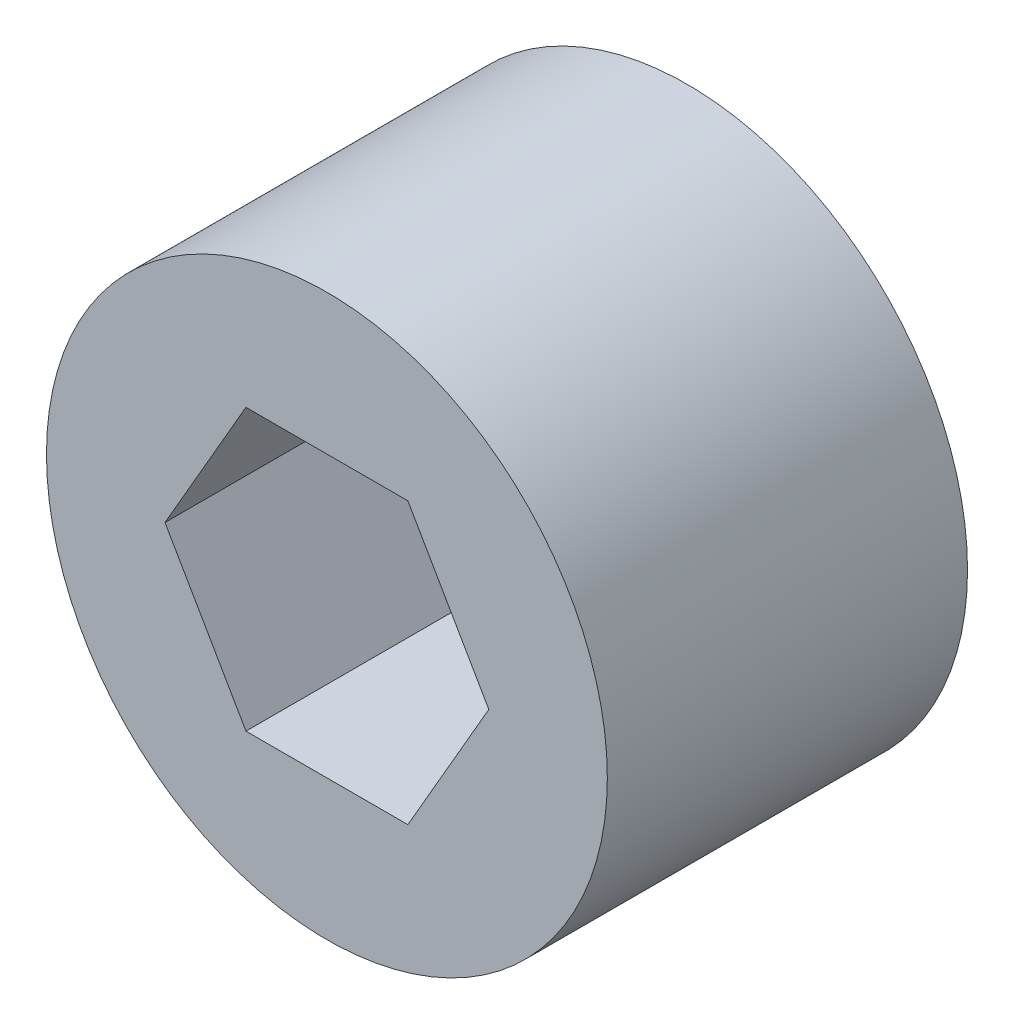
ISO-10303-21;
HEADER;
FILE_DESCRIPTION(('STEP AP214'),'2;1');
FILE_NAME('part.step','',(''),(''),'','','');
FILE_SCHEMA(('AUTOMOTIVE_DESIGN { 1 0 10303 214 1 1 1 1 }'));
ENDSEC;
DATA;
#1=APPLICATION_CONTEXT('core data for automotive mechanical design processes');
#2=APPLICATION_PROTOCOL_DEFINITION('international standard','automotive_design',2000,#1);
#3=PRODUCT_CONTEXT('',#1,'mechanical');
#4=PRODUCT('Part','Part','',(#3));
#5=PRODUCT_RELATED_PRODUCT_CATEGORY('part','',(#4));
#6=PRODUCT_DEFINITION_FORMATION('','',#4);
#7=PRODUCT_DEFINITION_CONTEXT('part definition',#1,'design');
#8=PRODUCT_DEFINITION('design','',#6,#7);
#9=PRODUCT_DEFINITION_SHAPE('','',#8);
#10=(LENGTH_UNIT() NAMED_UNIT(*) SI_UNIT(.MILLI.,.METRE.));
#11=(NAMED_UNIT(*) PLANE_ANGLE_UNIT() SI_UNIT($,.RADIAN.));
#12=(NAMED_UNIT(*) SI_UNIT($,.STERADIAN.) SOLID_ANGLE_UNIT());
#13=UNCERTAINTY_MEASURE_WITH_UNIT(LENGTH_MEASURE(1.E-05),#10,'distance_accuracy_value','');
#14=(GEOMETRIC_REPRESENTATION_CONTEXT(3) GLOBAL_UNCERTAINTY_ASSIGNED_CONTEXT((#13)) GLOBAL_UNIT_ASSIGNED_CONTEXT((#10,
#11,#12)) REPRESENTATION_CONTEXT('',''));
#15=CARTESIAN_POINT('',(0.,0.,0.));
#16=DIRECTION('',(0.,0.,1.));
#17=DIRECTION('',(1.,0.,0.));
#18=AXIS2_PLACEMENT_3D('',#15,#16,#17);
#19=CARTESIAN_POINT('',(0.,0.,8.15594));
#20=DIRECTION('',(0.,0.,1.));
#21=DIRECTION('',(1.,0.,0.));
#22=AXIS2_PLACEMENT_3D('',#19,#20,#21);
#23=PLANE('',#22);
#24=CARTESIAN_POINT('',(0.,0.,8.15594));
#25=DIRECTION('',(0.,0.,1.));
#26=DIRECTION('',(1.,0.,0.));
#27=AXIS2_PLACEMENT_3D('',#24,#25,#26);
#28=CIRCLE('',#27,12.7);
#29=CARTESIAN_POINT('',(12.7,0.,8.15594));
#30=VERTEX_POINT('',#29);
#31=EDGE_CURVE('E11',#30,#30,#28,.T.);
#32=ORIENTED_EDGE('',*,*,#31,.T.);
#33=EDGE_LOOP('',(#32));
#34=FACE_BOUND('',#33,.T.);
#35=DIRECTION('',(0.5,-0.866025403784439,0.));
#36=VECTOR('',#35,1.);
#37=CARTESIAN_POINT('',(-7.33234841870825,0.,8.15594));
#38=LINE('',#37,#36);
#39=CARTESIAN_POINT('',(-7.33234841870825,0.,8.15594));
#40=VERTEX_POINT('',#39);
#41=CARTESIAN_POINT('',(-3.66617420935412,-6.35,8.15594));
#42=VERTEX_POINT('',#41);
#43=EDGE_CURVE('E94',#40,#42,#38,.T.);
#44=ORIENTED_EDGE('',*,*,#43,.F.);
#45=DIRECTION('',(-0.5,-0.866025403784439,0.));
#46=VECTOR('',#45,1.);
#47=CARTESIAN_POINT('',(-3.66617420935412,6.35,8.15594));
#48=LINE('',#47,#46);
#49=CARTESIAN_POINT('',(-3.66617420935412,6.35,8.15594));
#50=VERTEX_POINT('',#49);
#51=EDGE_CURVE('E86',#50,#40,#48,.T.);
#52=ORIENTED_EDGE('',*,*,#51,.F.);
#53=DIRECTION('',(-1.,0.,0.));
#54=VECTOR('',#53,1.);
#55=CARTESIAN_POINT('',(3.66617420935412,6.35,8.15594));
#56=LINE('',#55,#54);
#57=CARTESIAN_POINT('',(3.66617420935412,6.35,8.15594));
#58=VERTEX_POINT('',#57);
#59=EDGE_CURVE('E114',#58,#50,#56,.T.);
#60=ORIENTED_EDGE('',*,*,#59,.F.);
#61=DIRECTION('',(-0.5,0.866025403784438,0.));
#62=VECTOR('',#61,1.);
#63=CARTESIAN_POINT('',(7.33234841870824,0.,8.15594));
#64=LINE('',#63,#62);
#65=CARTESIAN_POINT('',(7.33234841870824,0.,8.15594));
#66=VERTEX_POINT('',#65);
#67=EDGE_CURVE('E112',#66,#58,#64,.T.);
#68=ORIENTED_EDGE('',*,*,#67,.F.);
#69=DIRECTION('',(0.5,0.866025403784439,0.));
#70=VECTOR('',#69,1.);
#71=CARTESIAN_POINT('',(3.66617420935412,-6.35,8.15594));
#72=LINE('',#71,#70);
#73=CARTESIAN_POINT('',(3.66617420935412,-6.35,8.15594));
#74=VERTEX_POINT('',#73);
#75=EDGE_CURVE('E108',#74,#66,#72,.T.);
#76=ORIENTED_EDGE('',*,*,#75,.F.);
#77=DIRECTION('',(1.,0.,0.));
#78=VECTOR('',#77,1.);
#79=CARTESIAN_POINT('',(-3.66617420935412,-6.35,8.15594));
#80=LINE('',#79,#78);
#81=EDGE_CURVE('E106',#42,#74,#80,.T.);
#82=ORIENTED_EDGE('',*,*,#81,.F.);
#83=EDGE_LOOP('',(#44,#52,#60,#68,#76,#82));
#84=FACE_BOUND('',#83,.T.);
#85=ADVANCED_FACE('F33',(#34,#84),#23,.T.);
#86=CARTESIAN_POINT('',(0.,0.,-8.15594));
#87=DIRECTION('',(0.,0.,1.));
#88=DIRECTION('',(1.,0.,0.));
#89=AXIS2_PLACEMENT_3D('',#86,#87,#88);
#90=PLANE('',#89);
#91=CARTESIAN_POINT('',(0.,0.,-8.15594));
#92=DIRECTION('',(0.,0.,1.));
#93=DIRECTION('',(1.,0.,0.));
#94=AXIS2_PLACEMENT_3D('',#91,#92,#93);
#95=CIRCLE('',#94,12.7);
#96=CARTESIAN_POINT('',(12.7,0.,-8.15594));
#97=VERTEX_POINT('',#96);
#98=EDGE_CURVE('E37',#97,#97,#95,.T.);
#99=ORIENTED_EDGE('',*,*,#98,.F.);
#100=EDGE_LOOP('',(#99));
#101=FACE_BOUND('',#100,.T.);
#102=DIRECTION('',(-0.5,-0.866025403784439,0.));
#103=VECTOR('',#102,1.);
#104=CARTESIAN_POINT('',(-3.66617420935412,6.35,-8.15594));
#105=LINE('',#104,#103);
#106=CARTESIAN_POINT('',(-3.66617420935412,6.35,-8.15594));
#107=VERTEX_POINT('',#106);
#108=CARTESIAN_POINT('',(-7.33234841870825,0.,-8.15594));
#109=VERTEX_POINT('',#108);
#110=EDGE_CURVE('E56',#107,#109,#105,.T.);
#111=ORIENTED_EDGE('',*,*,#110,.T.);
#112=DIRECTION('',(0.5,-0.866025403784439,0.));
#113=VECTOR('',#112,1.);
#114=CARTESIAN_POINT('',(-7.33234841870825,0.,-8.15594));
#115=LINE('',#114,#113);
#116=CARTESIAN_POINT('',(-3.66617420935412,-6.35,-8.15594));
#117=VERTEX_POINT('',#116);
#118=EDGE_CURVE('E101',#109,#117,#115,.T.);
#119=ORIENTED_EDGE('',*,*,#118,.T.);
#120=DIRECTION('',(1.,0.,0.));
#121=VECTOR('',#120,1.);
#122=CARTESIAN_POINT('',(-3.66617420935412,-6.35,-8.15594));
#123=LINE('',#122,#121);
#124=CARTESIAN_POINT('',(3.66617420935412,-6.35,-8.15594));
#125=VERTEX_POINT('',#124);
#126=EDGE_CURVE('E118',#117,#125,#123,.T.);
#127=ORIENTED_EDGE('',*,*,#126,.T.);
#128=DIRECTION('',(0.5,0.866025403784439,0.));
#129=VECTOR('',#128,1.);
#130=CARTESIAN_POINT('',(3.66617420935412,-6.35,-8.15594));
#131=LINE('',#130,#129);
#132=CARTESIAN_POINT('',(7.33234841870824,0.,-8.15594));
#133=VERTEX_POINT('',#132);
#134=EDGE_CURVE('E121',#125,#133,#131,.T.);
#135=ORIENTED_EDGE('',*,*,#134,.T.);
#136=DIRECTION('',(-0.5,0.866025403784438,0.));
#137=VECTOR('',#136,1.);
#138=CARTESIAN_POINT('',(7.33234841870824,0.,-8.15594));
#139=LINE('',#138,#137);
#140=CARTESIAN_POINT('',(3.66617420935412,6.35,-8.15594));
#141=VERTEX_POINT('',#140);
#142=EDGE_CURVE('E124',#133,#141,#139,.T.);
#143=ORIENTED_EDGE('',*,*,#142,.T.);
#144=DIRECTION('',(-1.,0.,0.));
#145=VECTOR('',#144,1.);
#146=CARTESIAN_POINT('',(3.66617420935412,6.35,-8.15594));
#147=LINE('',#146,#145);
#148=EDGE_CURVE('E95',#141,#107,#147,.T.);
#149=ORIENTED_EDGE('',*,*,#148,.T.);
#150=EDGE_LOOP('',(#111,#119,#127,#135,#143,#149));
#151=FACE_BOUND('',#150,.T.);
#152=ADVANCED_FACE('F141',(#101,#151),#90,.F.);
#153=CARTESIAN_POINT('',(0.,0.,8.15594));
#154=DIRECTION('',(0.,0.,-1.));
#155=DIRECTION('',(-1.,0.,0.));
#156=AXIS2_PLACEMENT_3D('',#153,#154,#155);
#157=CYLINDRICAL_SURFACE('',#156,12.7);
#158=ORIENTED_EDGE('',*,*,#31,.F.);
#159=EDGE_LOOP('',(#158));
#160=FACE_BOUND('',#159,.T.);
#161=ORIENTED_EDGE('',*,*,#98,.T.);
#162=EDGE_LOOP('',(#161));
#163=FACE_BOUND('',#162,.T.);
#164=ADVANCED_FACE('F35',(#160,#163),#157,.T.);
#165=CARTESIAN_POINT('',(-3.66617420935412,6.35,8.15594));
#166=DIRECTION('',(0.866025403784439,-0.5,0.));
#167=DIRECTION('',(0.5,0.866025403784439,0.));
#168=AXIS2_PLACEMENT_3D('',#165,#166,#167);
#169=PLANE('',#168);
#170=ORIENTED_EDGE('',*,*,#110,.F.);
#171=DIRECTION('',(0.,0.,-1.));
#172=VECTOR('',#171,1.);
#173=CARTESIAN_POINT('',(-3.66617420935412,6.35,8.15594));
#174=LINE('',#173,#172);
#175=EDGE_CURVE('E90',#50,#107,#174,.T.);
#176=ORIENTED_EDGE('',*,*,#175,.F.);
#177=ORIENTED_EDGE('',*,*,#51,.T.);
#178=DIRECTION('',(0.,0.,-1.));
#179=VECTOR('',#178,1.);
#180=CARTESIAN_POINT('',(-7.33234841870825,0.,8.15594));
#181=LINE('',#180,#179);
#182=EDGE_CURVE('E89',#40,#109,#181,.T.);
#183=ORIENTED_EDGE('',*,*,#182,.T.);
#184=EDGE_LOOP('',(#170,#176,#177,#183));
#185=FACE_BOUND('',#184,.T.);
#186=ADVANCED_FACE('F88',(#185),#169,.T.);
#187=CARTESIAN_POINT('',(-7.33234841870825,0.,8.15594));
#188=DIRECTION('',(0.866025403784439,0.5,0.));
#189=DIRECTION('',(-0.5,0.866025403784439,0.));
#190=AXIS2_PLACEMENT_3D('',#187,#188,#189);
#191=PLANE('',#190);
#192=ORIENTED_EDGE('',*,*,#118,.F.);
#193=ORIENTED_EDGE('',*,*,#182,.F.);
#194=ORIENTED_EDGE('',*,*,#43,.T.);
#195=DIRECTION('',(0.,0.,-1.));
#196=VECTOR('',#195,1.);
#197=CARTESIAN_POINT('',(-3.66617420935412,-6.35,8.15594));
#198=LINE('',#197,#196);
#199=EDGE_CURVE('E102',#42,#117,#198,.T.);
#200=ORIENTED_EDGE('',*,*,#199,.T.);
#201=EDGE_LOOP('',(#192,#193,#194,#200));
#202=FACE_BOUND('',#201,.T.);
#203=ADVANCED_FACE('F98',(#202),#191,.T.);
#204=CARTESIAN_POINT('',(-3.66617420935412,-6.35,8.15594));
#205=DIRECTION('',(0.,1.,0.));
#206=DIRECTION('',(-1.,0.,0.));
#207=AXIS2_PLACEMENT_3D('',#204,#205,#206);
#208=PLANE('',#207);
#209=ORIENTED_EDGE('',*,*,#126,.F.);
#210=ORIENTED_EDGE('',*,*,#199,.F.);
#211=ORIENTED_EDGE('',*,*,#81,.T.);
#212=DIRECTION('',(0.,0.,-1.));
#213=VECTOR('',#212,1.);
#214=CARTESIAN_POINT('',(3.66617420935412,-6.35,8.15594));
#215=LINE('',#214,#213);
#216=EDGE_CURVE('E133',#74,#125,#215,.T.);
#217=ORIENTED_EDGE('',*,*,#216,.T.);
#218=EDGE_LOOP('',(#209,#210,#211,#217));
#219=FACE_BOUND('',#218,.T.);
#220=ADVANCED_FACE('F137',(#219),#208,.T.);
#221=CARTESIAN_POINT('',(3.66617420935412,-6.35,8.15594));
#222=DIRECTION('',(-0.866025403784439,0.5,0.));
#223=DIRECTION('',(-0.5,-0.866025403784439,0.));
#224=AXIS2_PLACEMENT_3D('',#221,#222,#223);
#225=PLANE('',#224);
#226=ORIENTED_EDGE('',*,*,#134,.F.);
#227=ORIENTED_EDGE('',*,*,#216,.F.);
#228=ORIENTED_EDGE('',*,*,#75,.T.);
#229=DIRECTION('',(0.,0.,-1.));
#230=VECTOR('',#229,1.);
#231=CARTESIAN_POINT('',(7.33234841870824,0.,8.15594));
#232=LINE('',#231,#230);
#233=EDGE_CURVE('E131',#66,#133,#232,.T.);
#234=ORIENTED_EDGE('',*,*,#233,.T.);
#235=EDGE_LOOP('',(#226,#227,#228,#234));
#236=FACE_BOUND('',#235,.T.);
#237=ADVANCED_FACE('F149',(#236),#225,.T.);
#238=CARTESIAN_POINT('',(7.33234841870824,0.,8.15594));
#239=DIRECTION('',(-0.866025403784438,-0.5,0.));
#240=DIRECTION('',(0.5,-0.866025403784439,0.));
#241=AXIS2_PLACEMENT_3D('',#238,#239,#240);
#242=PLANE('',#241);
#243=ORIENTED_EDGE('',*,*,#142,.F.);
#244=ORIENTED_EDGE('',*,*,#233,.F.);
#245=ORIENTED_EDGE('',*,*,#67,.T.);
#246=DIRECTION('',(0.,0.,-1.));
#247=VECTOR('',#246,1.);
#248=CARTESIAN_POINT('',(3.66617420935412,6.35,8.15594));
#249=LINE('',#248,#247);
#250=EDGE_CURVE('E48',#58,#141,#249,.T.);
#251=ORIENTED_EDGE('',*,*,#250,.T.);
#252=EDGE_LOOP('',(#243,#244,#245,#251));
#253=FACE_BOUND('',#252,.T.);
#254=ADVANCED_FACE('F147',(#253),#242,.T.);
#255=CARTESIAN_POINT('',(3.66617420935412,6.35,8.15594));
#256=DIRECTION('',(0.,-1.,0.));
#257=DIRECTION('',(0.,0.,-1.));
#258=AXIS2_PLACEMENT_3D('',#255,#256,#257);
#259=PLANE('',#258);
#260=ORIENTED_EDGE('',*,*,#148,.F.);
#261=ORIENTED_EDGE('',*,*,#250,.F.);
#262=ORIENTED_EDGE('',*,*,#59,.T.);
#263=ORIENTED_EDGE('',*,*,#175,.T.);
#264=EDGE_LOOP('',(#260,#261,#262,#263));
#265=FACE_BOUND('',#264,.T.);
#266=ADVANCED_FACE('F143',(#265),#259,.T.);
#267=CLOSED_SHELL('',(#85,#152,#164,#186,#203,#220,#237,#254,#266));
#268=MANIFOLD_SOLID_BREP('B2',#267);
#269=ADVANCED_BREP_SHAPE_REPRESENTATION('',(#18,#268),#14);
#270=SHAPE_DEFINITION_REPRESENTATION(#9,#269);
ENDSEC;
END-ISO-10303-21;
